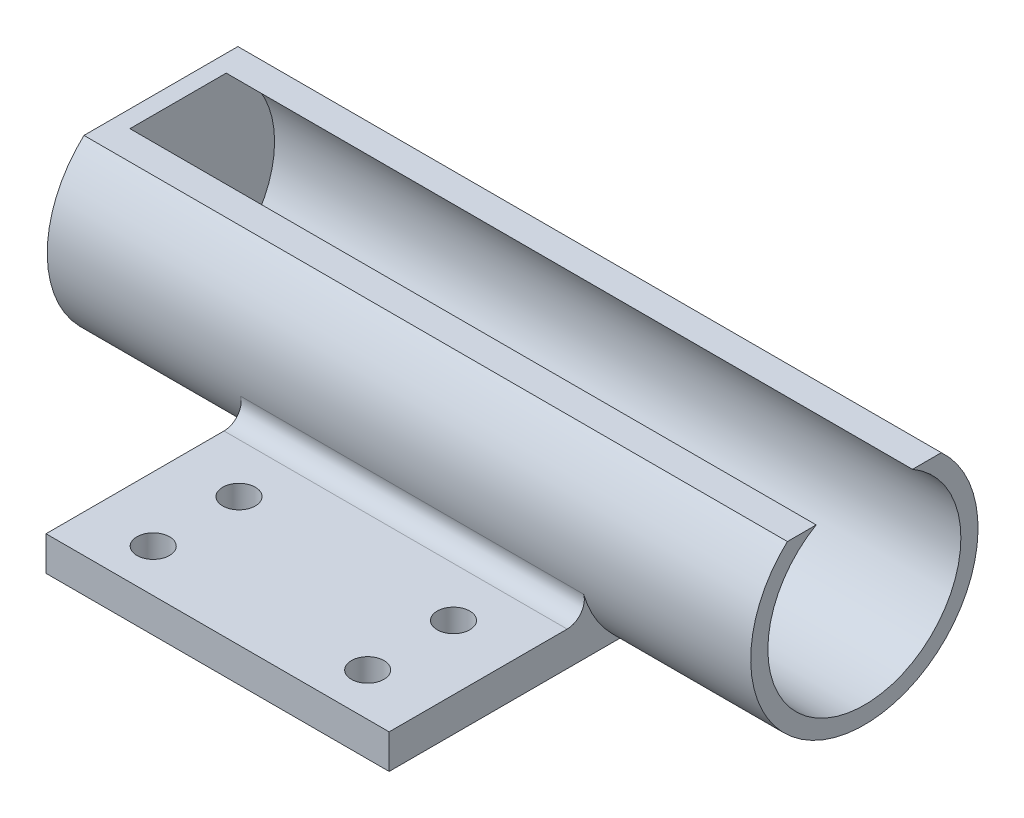
ISO-10303-21;
HEADER;
FILE_DESCRIPTION(('STEP AP214'),'2;1');
FILE_NAME('part.step','',(''),(''),'','','');
FILE_SCHEMA(('AUTOMOTIVE_DESIGN { 1 0 10303 214 1 1 1 1 }'));
ENDSEC;
DATA;
#1=APPLICATION_CONTEXT('core data for automotive mechanical design processes');
#2=APPLICATION_PROTOCOL_DEFINITION('international standard','automotive_design',2000,#1);
#3=PRODUCT_CONTEXT('',#1,'mechanical');
#4=PRODUCT('Part','Part','',(#3));
#5=PRODUCT_RELATED_PRODUCT_CATEGORY('part','',(#4));
#6=PRODUCT_DEFINITION_FORMATION('','',#4);
#7=PRODUCT_DEFINITION_CONTEXT('part definition',#1,'design');
#8=PRODUCT_DEFINITION('design','',#6,#7);
#9=PRODUCT_DEFINITION_SHAPE('','',#8);
#10=(LENGTH_UNIT() NAMED_UNIT(*) SI_UNIT(.MILLI.,.METRE.));
#11=(NAMED_UNIT(*) PLANE_ANGLE_UNIT() SI_UNIT($,.RADIAN.));
#12=(NAMED_UNIT(*) SI_UNIT($,.STERADIAN.) SOLID_ANGLE_UNIT());
#13=UNCERTAINTY_MEASURE_WITH_UNIT(LENGTH_MEASURE(1.E-05),#10,'distance_accuracy_value','');
#14=(GEOMETRIC_REPRESENTATION_CONTEXT(3) GLOBAL_UNCERTAINTY_ASSIGNED_CONTEXT((#13)) GLOBAL_UNIT_ASSIGNED_CONTEXT((#10,
#11,#12)) REPRESENTATION_CONTEXT('',''));
#15=CARTESIAN_POINT('',(0.,0.,0.));
#16=DIRECTION('',(0.,0.,1.));
#17=DIRECTION('',(1.,0.,0.));
#18=AXIS2_PLACEMENT_3D('',#15,#16,#17);
#19=CARTESIAN_POINT('',(-7.5,4.,-15.));
#20=DIRECTION('',(1.,0.,0.));
#21=DIRECTION('',(0.,0.,-1.));
#22=AXIS2_PLACEMENT_3D('',#19,#20,#21);
#23=PLANE('',#22);
#24=CARTESIAN_POINT('',(-7.50000000000001,10.25,-30.3964278118733));
#25=DIRECTION('',(-1.,0.,0.));
#26=DIRECTION('',(0.,0.,1.));
#27=AXIS2_PLACEMENT_3D('',#24,#25,#26);
#28=CIRCLE('',#27,13.25);
#29=CARTESIAN_POINT('',(-7.5,0.,-22.));
#30=VERTEX_POINT('',#29);
#31=CARTESIAN_POINT('',(-7.5,6.55737704918032,-17.6713723800459));
#32=VERTEX_POINT('',#31);
#33=EDGE_CURVE('E208',#30,#32,#28,.T.);
#34=ORIENTED_EDGE('',*,*,#33,.F.);
#35=DIRECTION('',(0.,0.,1.));
#36=VECTOR('',#35,1.);
#37=CARTESIAN_POINT('',(-7.5,0.,-15.));
#38=LINE('',#37,#36);
#39=CARTESIAN_POINT('',(-7.5,0.,5.));
#40=VERTEX_POINT('',#39);
#41=EDGE_CURVE('E187',#30,#40,#38,.T.);
#42=ORIENTED_EDGE('',*,*,#41,.T.);
#43=DIRECTION('',(0.,-1.,0.));
#44=VECTOR('',#43,1.);
#45=CARTESIAN_POINT('',(-7.5,4.,5.));
#46=LINE('',#45,#44);
#47=CARTESIAN_POINT('',(-7.5,4.,5.));
#48=VERTEX_POINT('',#47);
#49=EDGE_CURVE('E200',#48,#40,#46,.T.);
#50=ORIENTED_EDGE('',*,*,#49,.F.);
#51=DIRECTION('',(0.,0.,1.));
#52=VECTOR('',#51,1.);
#53=CARTESIAN_POINT('',(-7.5,4.,-15.));
#54=LINE('',#53,#52);
#55=CARTESIAN_POINT('',(-7.5,4.,-15.7506092959965));
#56=VERTEX_POINT('',#55);
#57=EDGE_CURVE('E193',#56,#48,#54,.T.);
#58=ORIENTED_EDGE('',*,*,#57,.F.);
#59=CARTESIAN_POINT('',(-7.5,6.,-15.7506092959965));
#60=DIRECTION('',(1.,0.,0.));
#61=DIRECTION('',(0.,0.,-1.));
#62=AXIS2_PLACEMENT_3D('',#59,#60,#61);
#63=CIRCLE('',#62,2.);
#64=EDGE_CURVE('E11',#56,#32,#63,.T.);
#65=ORIENTED_EDGE('',*,*,#64,.T.);
#66=EDGE_LOOP('',(#34,#42,#50,#58,#65));
#67=FACE_BOUND('',#66,.T.);
#68=ADVANCED_FACE('F35',(#67),#23,.F.);
#69=CARTESIAN_POINT('',(32.5,4.,-15.));
#70=DIRECTION('',(-1.,0.,0.));
#71=DIRECTION('',(0.,0.,1.));
#72=AXIS2_PLACEMENT_3D('',#69,#70,#71);
#73=PLANE('',#72);
#74=CARTESIAN_POINT('',(32.5,10.25,-30.3964278118733));
#75=DIRECTION('',(1.,0.,0.));
#76=DIRECTION('',(0.,0.,-1.));
#77=AXIS2_PLACEMENT_3D('',#74,#75,#76);
#78=CIRCLE('',#77,13.25);
#79=CARTESIAN_POINT('',(32.5,6.55737704918033,-17.6713723800459));
#80=VERTEX_POINT('',#79);
#81=CARTESIAN_POINT('',(32.5,0.,-22.));
#82=VERTEX_POINT('',#81);
#83=EDGE_CURVE('E203',#80,#82,#78,.T.);
#84=ORIENTED_EDGE('',*,*,#83,.F.);
#85=CARTESIAN_POINT('',(32.5,6.,-15.7506092959965));
#86=DIRECTION('',(-1.,0.,0.));
#87=DIRECTION('',(0.,0.,1.));
#88=AXIS2_PLACEMENT_3D('',#85,#86,#87);
#89=CIRCLE('',#88,2.);
#90=CARTESIAN_POINT('',(32.5,4.,-15.7506092959965));
#91=VERTEX_POINT('',#90);
#92=EDGE_CURVE('E44',#80,#91,#89,.T.);
#93=ORIENTED_EDGE('',*,*,#92,.T.);
#94=DIRECTION('',(0.,0.,-1.));
#95=VECTOR('',#94,1.);
#96=CARTESIAN_POINT('',(32.5,4.,-15.));
#97=LINE('',#96,#95);
#98=CARTESIAN_POINT('',(32.5,4.,5.));
#99=VERTEX_POINT('',#98);
#100=EDGE_CURVE('E192',#99,#91,#97,.T.);
#101=ORIENTED_EDGE('',*,*,#100,.F.);
#102=DIRECTION('',(0.,-1.,0.));
#103=VECTOR('',#102,1.);
#104=CARTESIAN_POINT('',(32.5,4.,5.));
#105=LINE('',#104,#103);
#106=CARTESIAN_POINT('',(32.5,0.,5.));
#107=VERTEX_POINT('',#106);
#108=EDGE_CURVE('E197',#99,#107,#105,.T.);
#109=ORIENTED_EDGE('',*,*,#108,.T.);
#110=DIRECTION('',(0.,0.,-1.));
#111=VECTOR('',#110,1.);
#112=CARTESIAN_POINT('',(32.5,0.,-15.));
#113=LINE('',#112,#111);
#114=EDGE_CURVE('E196',#107,#82,#113,.T.);
#115=ORIENTED_EDGE('',*,*,#114,.T.);
#116=EDGE_LOOP('',(#84,#93,#101,#109,#115));
#117=FACE_BOUND('',#116,.T.);
#118=ADVANCED_FACE('F244',(#117),#73,.F.);
#119=CARTESIAN_POINT('',(0.,4.,0.));
#120=DIRECTION('',(0.,-1.,0.));
#121=DIRECTION('',(0.,0.,-1.));
#122=AXIS2_PLACEMENT_3D('',#119,#120,#121);
#123=PLANE('',#122);
#124=CARTESIAN_POINT('',(25.,4.,-10.));
#125=DIRECTION('',(0.,1.,0.));
#126=DIRECTION('',(0.,0.,-1.));
#127=AXIS2_PLACEMENT_3D('',#124,#125,#126);
#128=CIRCLE('',#127,1.9);
#129=CARTESIAN_POINT('',(25.,4.,-11.9));
#130=VERTEX_POINT('',#129);
#131=EDGE_CURVE('E172',#130,#130,#128,.T.);
#132=ORIENTED_EDGE('',*,*,#131,.F.);
#133=EDGE_LOOP('',(#132));
#134=FACE_BOUND('',#133,.T.);
#135=CARTESIAN_POINT('',(0.,4.,0.));
#136=DIRECTION('',(0.,1.,0.));
#137=DIRECTION('',(0.,0.,1.));
#138=AXIS2_PLACEMENT_3D('',#135,#136,#137);
#139=CIRCLE('',#138,1.9);
#140=CARTESIAN_POINT('',(0.,4.,1.9));
#141=VERTEX_POINT('',#140);
#142=EDGE_CURVE('E184',#141,#141,#139,.T.);
#143=ORIENTED_EDGE('',*,*,#142,.F.);
#144=EDGE_LOOP('',(#143));
#145=FACE_BOUND('',#144,.T.);
#146=ORIENTED_EDGE('',*,*,#100,.T.);
#147=DIRECTION('',(1.,0.,0.));
#148=VECTOR('',#147,1.);
#149=CARTESIAN_POINT('',(0.,4.,-15.7506092959965));
#150=LINE('',#149,#148);
#151=EDGE_CURVE('E58',#91,#56,#150,.F.);
#152=ORIENTED_EDGE('',*,*,#151,.T.);
#153=ORIENTED_EDGE('',*,*,#57,.T.);
#154=DIRECTION('',(1.,0.,0.));
#155=VECTOR('',#154,1.);
#156=CARTESIAN_POINT('',(32.5,4.,5.));
#157=LINE('',#156,#155);
#158=EDGE_CURVE('E190',#48,#99,#157,.T.);
#159=ORIENTED_EDGE('',*,*,#158,.T.);
#160=EDGE_LOOP('',(#146,#152,#153,#159));
#161=FACE_BOUND('',#160,.T.);
#162=CARTESIAN_POINT('',(0.,4.,-10.));
#163=DIRECTION('',(0.,1.,0.));
#164=DIRECTION('',(0.,0.,1.));
#165=AXIS2_PLACEMENT_3D('',#162,#163,#164);
#166=CIRCLE('',#165,1.9);
#167=CARTESIAN_POINT('',(0.,4.,-8.1));
#168=VERTEX_POINT('',#167);
#169=EDGE_CURVE('E178',#168,#168,#166,.T.);
#170=ORIENTED_EDGE('',*,*,#169,.F.);
#171=EDGE_LOOP('',(#170));
#172=FACE_BOUND('',#171,.T.);
#173=CARTESIAN_POINT('',(25.,4.,0.));
#174=DIRECTION('',(0.,1.,0.));
#175=DIRECTION('',(0.,0.,-1.));
#176=AXIS2_PLACEMENT_3D('',#173,#174,#175);
#177=CIRCLE('',#176,1.9);
#178=CARTESIAN_POINT('',(25.,4.,-1.9));
#179=VERTEX_POINT('',#178);
#180=EDGE_CURVE('E166',#179,#179,#177,.T.);
#181=ORIENTED_EDGE('',*,*,#180,.F.);
#182=EDGE_LOOP('',(#181));
#183=FACE_BOUND('',#182,.T.);
#184=ADVANCED_FACE('F238',(#134,#145,#161,#172,#183),#123,.F.);
#185=CARTESIAN_POINT('',(0.,0.,0.));
#186=DIRECTION('',(0.,-1.,0.));
#187=DIRECTION('',(0.,0.,-1.));
#188=AXIS2_PLACEMENT_3D('',#185,#186,#187);
#189=PLANE('',#188);
#190=CARTESIAN_POINT('',(25.,0.,-10.));
#191=DIRECTION('',(0.,1.,0.));
#192=DIRECTION('',(0.,0.,-1.));
#193=AXIS2_PLACEMENT_3D('',#190,#191,#192);
#194=CIRCLE('',#193,1.9);
#195=CARTESIAN_POINT('',(25.,0.,-11.9));
#196=VERTEX_POINT('',#195);
#197=EDGE_CURVE('E169',#196,#196,#194,.T.);
#198=ORIENTED_EDGE('',*,*,#197,.T.);
#199=EDGE_LOOP('',(#198));
#200=FACE_BOUND('',#199,.T.);
#201=CARTESIAN_POINT('',(0.,0.,0.));
#202=DIRECTION('',(0.,1.,0.));
#203=DIRECTION('',(0.,0.,1.));
#204=AXIS2_PLACEMENT_3D('',#201,#202,#203);
#205=CIRCLE('',#204,1.9);
#206=CARTESIAN_POINT('',(0.,0.,1.9));
#207=VERTEX_POINT('',#206);
#208=EDGE_CURVE('E181',#207,#207,#205,.T.);
#209=ORIENTED_EDGE('',*,*,#208,.T.);
#210=EDGE_LOOP('',(#209));
#211=FACE_BOUND('',#210,.T.);
#212=ORIENTED_EDGE('',*,*,#41,.F.);
#213=DIRECTION('',(1.,0.,0.));
#214=VECTOR('',#213,1.);
#215=CARTESIAN_POINT('',(-44.2371450494029,0.,-22.));
#216=LINE('',#215,#214);
#217=EDGE_CURVE('E159',#30,#82,#216,.T.);
#218=ORIENTED_EDGE('',*,*,#217,.T.);
#219=ORIENTED_EDGE('',*,*,#114,.F.);
#220=DIRECTION('',(1.,0.,0.));
#221=VECTOR('',#220,1.);
#222=CARTESIAN_POINT('',(32.5,0.,5.));
#223=LINE('',#222,#221);
#224=EDGE_CURVE('E194',#40,#107,#223,.T.);
#225=ORIENTED_EDGE('',*,*,#224,.F.);
#226=EDGE_LOOP('',(#212,#218,#219,#225));
#227=FACE_BOUND('',#226,.T.);
#228=CARTESIAN_POINT('',(0.,0.,-10.));
#229=DIRECTION('',(0.,1.,0.));
#230=DIRECTION('',(0.,0.,1.));
#231=AXIS2_PLACEMENT_3D('',#228,#229,#230);
#232=CIRCLE('',#231,1.9);
#233=CARTESIAN_POINT('',(0.,0.,-8.1));
#234=VERTEX_POINT('',#233);
#235=EDGE_CURVE('E175',#234,#234,#232,.T.);
#236=ORIENTED_EDGE('',*,*,#235,.T.);
#237=EDGE_LOOP('',(#236));
#238=FACE_BOUND('',#237,.T.);
#239=CARTESIAN_POINT('',(25.,0.,0.));
#240=DIRECTION('',(0.,1.,0.));
#241=DIRECTION('',(0.,0.,-1.));
#242=AXIS2_PLACEMENT_3D('',#239,#240,#241);
#243=CIRCLE('',#242,1.9);
#244=CARTESIAN_POINT('',(25.,0.,-1.9));
#245=VERTEX_POINT('',#244);
#246=EDGE_CURVE('E118',#245,#245,#243,.T.);
#247=ORIENTED_EDGE('',*,*,#246,.T.);
#248=EDGE_LOOP('',(#247));
#249=FACE_BOUND('',#248,.T.);
#250=ADVANCED_FACE('F251',(#200,#211,#227,#238,#249),#189,.T.);
#251=CARTESIAN_POINT('',(32.5,4.,5.));
#252=DIRECTION('',(0.,0.,-1.));
#253=DIRECTION('',(-1.,0.,0.));
#254=AXIS2_PLACEMENT_3D('',#251,#252,#253);
#255=PLANE('',#254);
#256=ORIENTED_EDGE('',*,*,#224,.T.);
#257=ORIENTED_EDGE('',*,*,#108,.F.);
#258=ORIENTED_EDGE('',*,*,#158,.F.);
#259=ORIENTED_EDGE('',*,*,#49,.T.);
#260=EDGE_LOOP('',(#256,#257,#258,#259));
#261=FACE_BOUND('',#260,.T.);
#262=ADVANCED_FACE('F242',(#261),#255,.F.);
#263=CARTESIAN_POINT('',(0.,4.,0.));
#264=DIRECTION('',(0.,-1.,0.));
#265=DIRECTION('',(0.,0.,-1.));
#266=AXIS2_PLACEMENT_3D('',#263,#264,#265);
#267=CYLINDRICAL_SURFACE('',#266,1.9);
#268=ORIENTED_EDGE('',*,*,#142,.T.);
#269=EDGE_LOOP('',(#268));
#270=FACE_BOUND('',#269,.T.);
#271=ORIENTED_EDGE('',*,*,#208,.F.);
#272=EDGE_LOOP('',(#271));
#273=FACE_BOUND('',#272,.T.);
#274=ADVANCED_FACE('F257',(#270,#273),#267,.F.);
#275=CARTESIAN_POINT('',(0.,4.,-10.));
#276=DIRECTION('',(0.,-1.,0.));
#277=DIRECTION('',(0.,0.,-1.));
#278=AXIS2_PLACEMENT_3D('',#275,#276,#277);
#279=CYLINDRICAL_SURFACE('',#278,1.9);
#280=ORIENTED_EDGE('',*,*,#169,.T.);
#281=EDGE_LOOP('',(#280));
#282=FACE_BOUND('',#281,.T.);
#283=ORIENTED_EDGE('',*,*,#235,.F.);
#284=EDGE_LOOP('',(#283));
#285=FACE_BOUND('',#284,.T.);
#286=ADVANCED_FACE('F262',(#282,#285),#279,.F.);
#287=CARTESIAN_POINT('',(25.,4.,-10.));
#288=DIRECTION('',(0.,-1.,0.));
#289=DIRECTION('',(0.,0.,-1.));
#290=AXIS2_PLACEMENT_3D('',#287,#288,#289);
#291=CYLINDRICAL_SURFACE('',#290,1.9);
#292=ORIENTED_EDGE('',*,*,#131,.T.);
#293=EDGE_LOOP('',(#292));
#294=FACE_BOUND('',#293,.T.);
#295=ORIENTED_EDGE('',*,*,#197,.F.);
#296=EDGE_LOOP('',(#295));
#297=FACE_BOUND('',#296,.T.);
#298=ADVANCED_FACE('F279',(#294,#297),#291,.F.);
#299=CARTESIAN_POINT('',(25.,4.,0.));
#300=DIRECTION('',(0.,-1.,0.));
#301=DIRECTION('',(0.,0.,-1.));
#302=AXIS2_PLACEMENT_3D('',#299,#300,#301);
#303=CYLINDRICAL_SURFACE('',#302,1.9);
#304=ORIENTED_EDGE('',*,*,#180,.T.);
#305=EDGE_LOOP('',(#304));
#306=FACE_BOUND('',#305,.T.);
#307=ORIENTED_EDGE('',*,*,#246,.F.);
#308=EDGE_LOOP('',(#307));
#309=FACE_BOUND('',#308,.T.);
#310=ADVANCED_FACE('F277',(#306,#309),#303,.F.);
#311=CARTESIAN_POINT('',(-44.2371450494029,10.25,-30.3964278118734));
#312=DIRECTION('',(1.,0.,0.));
#313=DIRECTION('',(0.,0.,-1.));
#314=AXIS2_PLACEMENT_3D('',#311,#312,#313);
#315=CYLINDRICAL_SURFACE('',#314,13.25);
#316=DIRECTION('',(1.,0.,0.));
#317=VECTOR('',#316,1.);
#318=CARTESIAN_POINT('',(-44.2371450494029,6.55737704918033,-17.671372380046));
#319=LINE('',#318,#317);
#320=EDGE_CURVE('E220',#32,#80,#319,.T.);
#321=ORIENTED_EDGE('',*,*,#320,.T.);
#322=ORIENTED_EDGE('',*,*,#83,.T.);
#323=ORIENTED_EDGE('',*,*,#217,.F.);
#324=ORIENTED_EDGE('',*,*,#33,.T.);
#325=EDGE_LOOP('',(#321,#322,#323,#324));
#326=FACE_BOUND('',#325,.T.);
#327=DIRECTION('',(1.,0.,0.));
#328=VECTOR('',#327,1.);
#329=CARTESIAN_POINT('',(-44.2371450494029,20.,-21.4242485894102));
#330=LINE('',#329,#328);
#331=CARTESIAN_POINT('',(-29.5,20.,-21.4242485894101));
#332=VERTEX_POINT('',#331);
#333=CARTESIAN_POINT('',(52.5,20.,-21.4242485894102));
#334=VERTEX_POINT('',#333);
#335=EDGE_CURVE('E108',#332,#334,#330,.T.);
#336=ORIENTED_EDGE('',*,*,#335,.F.);
#337=CARTESIAN_POINT('',(-29.5,10.25,-30.3964278118733));
#338=DIRECTION('',(-1.,0.,0.));
#339=DIRECTION('',(0.,0.,1.));
#340=AXIS2_PLACEMENT_3D('',#337,#338,#339);
#341=CIRCLE('',#340,13.25);
#342=CARTESIAN_POINT('',(-29.5,20.,-39.3686070343365));
#343=VERTEX_POINT('',#342);
#344=EDGE_CURVE('E112',#343,#332,#341,.T.);
#345=ORIENTED_EDGE('',*,*,#344,.F.);
#346=DIRECTION('',(1.,0.,0.));
#347=VECTOR('',#346,1.);
#348=CARTESIAN_POINT('',(-44.2371450494029,20.,-39.3686070343365));
#349=LINE('',#348,#347);
#350=CARTESIAN_POINT('',(52.5,20.,-39.3686070343365));
#351=VERTEX_POINT('',#350);
#352=EDGE_CURVE('E125',#343,#351,#349,.T.);
#353=ORIENTED_EDGE('',*,*,#352,.T.);
#354=CARTESIAN_POINT('',(52.5,10.25,-30.3964278118733));
#355=DIRECTION('',(1.,0.,0.));
#356=DIRECTION('',(0.,0.,-1.));
#357=AXIS2_PLACEMENT_3D('',#354,#355,#356);
#358=CIRCLE('',#357,13.25);
#359=EDGE_CURVE('E114',#334,#351,#358,.T.);
#360=ORIENTED_EDGE('',*,*,#359,.F.);
#361=EDGE_LOOP('',(#336,#345,#353,#360));
#362=FACE_BOUND('',#361,.T.);
#363=ADVANCED_FACE('F110',(#326,#362),#315,.T.);
#364=CARTESIAN_POINT('',(-44.2371450494029,20.,0.));
#365=DIRECTION('',(0.,1.,0.));
#366=DIRECTION('',(0.,0.,1.));
#367=AXIS2_PLACEMENT_3D('',#364,#365,#366);
#368=PLANE('',#367);
#369=DIRECTION('',(1.,0.,0.));
#370=VECTOR('',#369,1.);
#371=CARTESIAN_POINT('',(-44.2371450494029,20.,-24.7839417317125));
#372=LINE('',#371,#370);
#373=CARTESIAN_POINT('',(-27.5,20.,-24.7839417317124));
#374=VERTEX_POINT('',#373);
#375=CARTESIAN_POINT('',(52.5,20.,-24.7839417317124));
#376=VERTEX_POINT('',#375);
#377=EDGE_CURVE('E119',#374,#376,#372,.T.);
#378=ORIENTED_EDGE('',*,*,#377,.F.);
#379=DIRECTION('',(0.,0.,-1.));
#380=VECTOR('',#379,1.);
#381=CARTESIAN_POINT('',(-27.5,20.,-39.3686070343365));
#382=LINE('',#381,#380);
#383=CARTESIAN_POINT('',(-27.5,20.,-36.0089138920342));
#384=VERTEX_POINT('',#383);
#385=EDGE_CURVE('E130',#374,#384,#382,.T.);
#386=ORIENTED_EDGE('',*,*,#385,.T.);
#387=DIRECTION('',(1.,0.,0.));
#388=VECTOR('',#387,1.);
#389=CARTESIAN_POINT('',(-44.2371450494029,20.,-36.0089138920343));
#390=LINE('',#389,#388);
#391=CARTESIAN_POINT('',(52.5,20.,-36.0089138920342));
#392=VERTEX_POINT('',#391);
#393=EDGE_CURVE('E145',#384,#392,#390,.T.);
#394=ORIENTED_EDGE('',*,*,#393,.T.);
#395=DIRECTION('',(0.,0.,1.));
#396=VECTOR('',#395,1.);
#397=CARTESIAN_POINT('',(52.5,20.,-36.0089138920342));
#398=LINE('',#397,#396);
#399=EDGE_CURVE('E158',#351,#392,#398,.T.);
#400=ORIENTED_EDGE('',*,*,#399,.F.);
#401=ORIENTED_EDGE('',*,*,#352,.F.);
#402=DIRECTION('',(0.,0.,-1.));
#403=VECTOR('',#402,1.);
#404=CARTESIAN_POINT('',(-29.5,20.,-39.3686070343365));
#405=LINE('',#404,#403);
#406=EDGE_CURVE('E122',#332,#343,#405,.T.);
#407=ORIENTED_EDGE('',*,*,#406,.F.);
#408=ORIENTED_EDGE('',*,*,#335,.T.);
#409=DIRECTION('',(0.,0.,1.));
#410=VECTOR('',#409,1.);
#411=CARTESIAN_POINT('',(52.5,20.,-24.7839417317124));
#412=LINE('',#411,#410);
#413=EDGE_CURVE('E154',#376,#334,#412,.T.);
#414=ORIENTED_EDGE('',*,*,#413,.F.);
#415=EDGE_LOOP('',(#378,#386,#394,#400,#401,#407,#408,#414));
#416=FACE_BOUND('',#415,.T.);
#417=ADVANCED_FACE('F123',(#416),#368,.T.);
#418=CARTESIAN_POINT('',(-44.2371450494029,10.25,-30.3964278118734));
#419=DIRECTION('',(1.,0.,0.));
#420=DIRECTION('',(0.,0.,-1.));
#421=AXIS2_PLACEMENT_3D('',#418,#419,#420);
#422=CYLINDRICAL_SURFACE('',#421,11.25);
#423=ORIENTED_EDGE('',*,*,#393,.F.);
#424=CARTESIAN_POINT('',(-27.5,10.25,-30.3964278118733));
#425=DIRECTION('',(1.,0.,0.));
#426=DIRECTION('',(0.,0.,1.));
#427=AXIS2_PLACEMENT_3D('',#424,#425,#426);
#428=CIRCLE('',#427,11.25);
#429=EDGE_CURVE('E127',#374,#384,#428,.T.);
#430=ORIENTED_EDGE('',*,*,#429,.F.);
#431=ORIENTED_EDGE('',*,*,#377,.T.);
#432=CARTESIAN_POINT('',(52.5,10.25,-30.3964278118733));
#433=DIRECTION('',(-1.,0.,0.));
#434=DIRECTION('',(0.,0.,-1.));
#435=AXIS2_PLACEMENT_3D('',#432,#433,#434);
#436=CIRCLE('',#435,11.25);
#437=EDGE_CURVE('E139',#392,#376,#436,.T.);
#438=ORIENTED_EDGE('',*,*,#437,.F.);
#439=EDGE_LOOP('',(#423,#430,#431,#438));
#440=FACE_BOUND('',#439,.T.);
#441=ADVANCED_FACE('F151',(#440),#422,.F.);
#442=CARTESIAN_POINT('',(52.5,10.25,-30.3964278118733));
#443=DIRECTION('',(1.,0.,0.));
#444=DIRECTION('',(0.,0.,-1.));
#445=AXIS2_PLACEMENT_3D('',#442,#443,#444);
#446=PLANE('',#445);
#447=ORIENTED_EDGE('',*,*,#437,.T.);
#448=ORIENTED_EDGE('',*,*,#413,.T.);
#449=ORIENTED_EDGE('',*,*,#359,.T.);
#450=ORIENTED_EDGE('',*,*,#399,.T.);
#451=EDGE_LOOP('',(#447,#448,#449,#450));
#452=FACE_BOUND('',#451,.T.);
#453=ADVANCED_FACE('F157',(#452),#446,.T.);
#454=CARTESIAN_POINT('',(-44.2371450494029,6.,-15.7506092959966));
#455=DIRECTION('',(1.,0.,0.));
#456=DIRECTION('',(0.,0.,-1.));
#457=AXIS2_PLACEMENT_3D('',#454,#455,#456);
#458=CYLINDRICAL_SURFACE('',#457,2.);
#459=ORIENTED_EDGE('',*,*,#64,.F.);
#460=ORIENTED_EDGE('',*,*,#151,.F.);
#461=ORIENTED_EDGE('',*,*,#92,.F.);
#462=ORIENTED_EDGE('',*,*,#320,.F.);
#463=EDGE_LOOP('',(#459,#460,#461,#462));
#464=FACE_BOUND('',#463,.T.);
#465=ADVANCED_FACE('F37',(#464),#458,.F.);
#466=CARTESIAN_POINT('',(-27.5,10.25,-30.3964278118733));
#467=DIRECTION('',(-1.,0.,0.));
#468=DIRECTION('',(0.,0.,1.));
#469=AXIS2_PLACEMENT_3D('',#466,#467,#468);
#470=PLANE('',#469);
#471=ORIENTED_EDGE('',*,*,#385,.F.);
#472=ORIENTED_EDGE('',*,*,#429,.T.);
#473=EDGE_LOOP('',(#471,#472));
#474=FACE_BOUND('',#473,.T.);
#475=ADVANCED_FACE('F356',(#474),#470,.F.);
#476=CARTESIAN_POINT('',(-29.5,10.25,-30.3964278118733));
#477=DIRECTION('',(-1.,0.,0.));
#478=DIRECTION('',(0.,0.,1.));
#479=AXIS2_PLACEMENT_3D('',#476,#477,#478);
#480=PLANE('',#479);
#481=ORIENTED_EDGE('',*,*,#344,.T.);
#482=ORIENTED_EDGE('',*,*,#406,.T.);
#483=EDGE_LOOP('',(#481,#482));
#484=FACE_BOUND('',#483,.T.);
#485=ADVANCED_FACE('F129',(#484),#480,.T.);
#486=CLOSED_SHELL('',(#68,#118,#184,#250,#262,#274,#286,#298,#310,#363,#417,#441,#453,#465,#475,#485));
#487=MANIFOLD_SOLID_BREP('B2',#486);
#488=ADVANCED_BREP_SHAPE_REPRESENTATION('',(#18,#487),#14);
#489=SHAPE_DEFINITION_REPRESENTATION(#9,#488);
ENDSEC;
END-ISO-10303-21;
